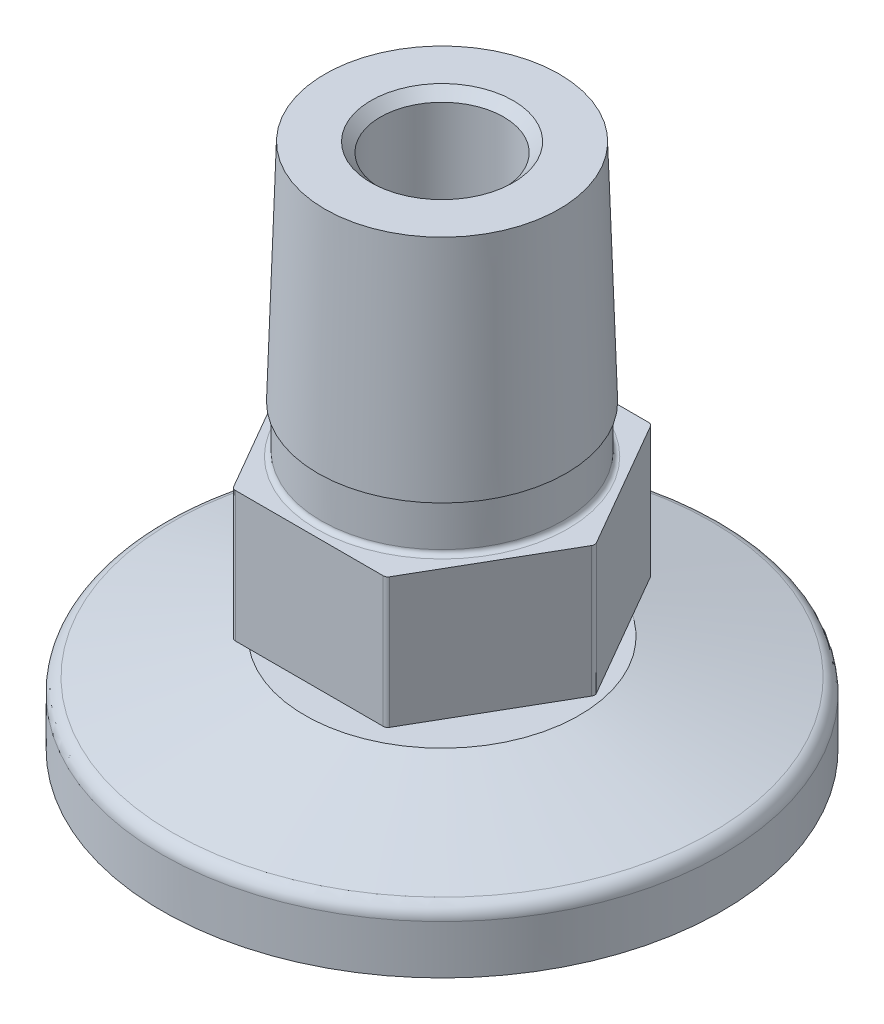
ISO-10303-21;
HEADER;
FILE_DESCRIPTION(('STEP AP214'),'2;1');
FILE_NAME('part.step','',(''),(''),'','','');
FILE_SCHEMA(('AUTOMOTIVE_DESIGN { 1 0 10303 214 1 1 1 1 }'));
ENDSEC;
DATA;
#1=APPLICATION_CONTEXT('core data for automotive mechanical design processes');
#2=APPLICATION_PROTOCOL_DEFINITION('international standard','automotive_design',2000,#1);
#3=PRODUCT_CONTEXT('',#1,'mechanical');
#4=PRODUCT('Part','Part','',(#3));
#5=PRODUCT_RELATED_PRODUCT_CATEGORY('part','',(#4));
#6=PRODUCT_DEFINITION_FORMATION('','',#4);
#7=PRODUCT_DEFINITION_CONTEXT('part definition',#1,'design');
#8=PRODUCT_DEFINITION('design','',#6,#7);
#9=PRODUCT_DEFINITION_SHAPE('','',#8);
#10=(LENGTH_UNIT() NAMED_UNIT(*) SI_UNIT(.MILLI.,.METRE.));
#11=(NAMED_UNIT(*) PLANE_ANGLE_UNIT() SI_UNIT($,.RADIAN.));
#12=(NAMED_UNIT(*) SI_UNIT($,.STERADIAN.) SOLID_ANGLE_UNIT());
#13=UNCERTAINTY_MEASURE_WITH_UNIT(LENGTH_MEASURE(1.E-05),#10,'distance_accuracy_value','');
#14=(GEOMETRIC_REPRESENTATION_CONTEXT(3) GLOBAL_UNCERTAINTY_ASSIGNED_CONTEXT((#13)) GLOBAL_UNIT_ASSIGNED_CONTEXT((#10,
#11,#12)) REPRESENTATION_CONTEXT('',''));
#15=CARTESIAN_POINT('',(0.,0.,0.));
#16=DIRECTION('',(0.,0.,1.));
#17=DIRECTION('',(1.,0.,0.));
#18=AXIS2_PLACEMENT_3D('',#15,#16,#17);
#19=CARTESIAN_POINT('',(0.,2.5,0.));
#20=DIRECTION('',(0.,1.,0.));
#21=DIRECTION('',(0.,0.,1.));
#22=AXIS2_PLACEMENT_3D('',#19,#20,#21);
#23=PLANE('',#22);
#24=CARTESIAN_POINT('',(0.,2.5,0.));
#25=DIRECTION('',(0.,-1.,0.));
#26=DIRECTION('',(0.,0.,-1.));
#27=AXIS2_PLACEMENT_3D('',#24,#25,#26);
#28=CIRCLE('',#27,8.1);
#29=CARTESIAN_POINT('',(0.,2.5,-8.1));
#30=VERTEX_POINT('',#29);
#31=EDGE_CURVE('E221',#30,#30,#28,.T.);
#32=ORIENTED_EDGE('',*,*,#31,.T.);
#33=EDGE_LOOP('',(#32));
#34=FACE_BOUND('',#33,.T.);
#35=CARTESIAN_POINT('',(0.,2.5,0.));
#36=DIRECTION('',(0.,1.,0.));
#37=DIRECTION('',(0.,0.,1.));
#38=AXIS2_PLACEMENT_3D('',#35,#36,#37);
#39=CIRCLE('',#38,3.302);
#40=CARTESIAN_POINT('',(0.,2.5,3.302));
#41=VERTEX_POINT('',#40);
#42=EDGE_CURVE('E572',#41,#41,#39,.F.);
#43=ORIENTED_EDGE('',*,*,#42,.F.);
#44=EDGE_LOOP('',(#43));
#45=FACE_BOUND('',#44,.T.);
#46=ADVANCED_FACE('F51',(#34,#45),#23,.F.);
#47=CARTESIAN_POINT('',(-6.27459645673935,28.194,0.));
#48=DIRECTION('',(0.,-1.,0.));
#49=DIRECTION('',(0.,0.,-1.));
#50=AXIS2_PLACEMENT_3D('',#47,#48,#49);
#51=PLANE('',#50);
#52=CARTESIAN_POINT('',(0.,28.194,0.));
#53=DIRECTION('',(0.,-1.,0.));
#54=DIRECTION('',(0.,0.,-1.));
#55=AXIS2_PLACEMENT_3D('',#52,#53,#54);
#56=CIRCLE('',#55,3.81000000000001);
#57=CARTESIAN_POINT('',(0.,28.194,-3.81000000000001));
#58=VERTEX_POINT('',#57);
#59=EDGE_CURVE('E311',#58,#58,#56,.T.);
#60=ORIENTED_EDGE('',*,*,#59,.T.);
#61=EDGE_LOOP('',(#60));
#62=FACE_BOUND('',#61,.T.);
#63=CARTESIAN_POINT('',(0.,28.194,0.));
#64=DIRECTION('',(0.,-1.,0.));
#65=DIRECTION('',(0.,0.,-1.));
#66=AXIS2_PLACEMENT_3D('',#63,#64,#65);
#67=CIRCLE('',#66,6.27459645673935);
#68=CARTESIAN_POINT('',(0.,28.194,-6.27459645673935));
#69=VERTEX_POINT('',#68);
#70=EDGE_CURVE('E180',#69,#69,#67,.T.);
#71=ORIENTED_EDGE('',*,*,#70,.F.);
#72=EDGE_LOOP('',(#71));
#73=FACE_BOUND('',#72,.T.);
#74=ADVANCED_FACE('F330',(#62,#73),#51,.F.);
#75=CARTESIAN_POINT('',(0.,13.589,0.));
#76=DIRECTION('',(0.,1.,0.));
#77=DIRECTION('',(0.,0.,1.));
#78=AXIS2_PLACEMENT_3D('',#75,#76,#77);
#79=PLANE('',#78);
#80=CARTESIAN_POINT('',(0.,13.589,0.));
#81=DIRECTION('',(0.,1.,0.));
#82=DIRECTION('',(0.,0.,1.));
#83=AXIS2_PLACEMENT_3D('',#80,#81,#82);
#84=CIRCLE('',#83,6.73099999999999);
#85=CARTESIAN_POINT('',(0.,13.589,6.73099999999999));
#86=VERTEX_POINT('',#85);
#87=EDGE_CURVE('E60',#86,#86,#84,.F.);
#88=ORIENTED_EDGE('',*,*,#87,.T.);
#89=EDGE_LOOP('',(#88));
#90=FACE_BOUND('',#89,.T.);
#91=DIRECTION('',(0.5,0.,-0.866025403784439));
#92=VECTOR('',#91,1.);
#93=CARTESIAN_POINT('',(4.10611511447662,13.589,7.112));
#94=LINE('',#93,#92);
#95=CARTESIAN_POINT('',(4.1794385986637,13.589,6.985));
#96=VERTEX_POINT('',#95);
#97=CARTESIAN_POINT('',(8.13890674476616,13.589,0.126999999999997));
#98=VERTEX_POINT('',#97);
#99=EDGE_CURVE('E193',#96,#98,#94,.T.);
#100=ORIENTED_EDGE('',*,*,#99,.T.);
#101=CARTESIAN_POINT('',(7.91893629220491,13.589,0.));
#102=DIRECTION('',(0.,1.,0.));
#103=DIRECTION('',(0.,0.,1.));
#104=AXIS2_PLACEMENT_3D('',#101,#102,#103);
#105=CIRCLE('',#104,0.254);
#106=CARTESIAN_POINT('',(8.13890674476616,13.589,-0.127000000000004));
#107=VERTEX_POINT('',#106);
#108=EDGE_CURVE('E270',#98,#107,#105,.T.);
#109=ORIENTED_EDGE('',*,*,#108,.T.);
#110=DIRECTION('',(-0.5,0.,-0.866025403784439));
#111=VECTOR('',#110,1.);
#112=CARTESIAN_POINT('',(8.21223022895324,13.589,0.));
#113=LINE('',#112,#111);
#114=CARTESIAN_POINT('',(4.1794385986637,13.589,-6.985));
#115=VERTEX_POINT('',#114);
#116=EDGE_CURVE('E170',#107,#115,#113,.T.);
#117=ORIENTED_EDGE('',*,*,#116,.T.);
#118=CARTESIAN_POINT('',(3.95946814610246,13.589,-6.858));
#119=DIRECTION('',(0.,1.,0.));
#120=DIRECTION('',(0.,0.,1.));
#121=AXIS2_PLACEMENT_3D('',#118,#119,#120);
#122=CIRCLE('',#121,0.254);
#123=CARTESIAN_POINT('',(3.95946814610246,13.589,-7.112));
#124=VERTEX_POINT('',#123);
#125=EDGE_CURVE('E261',#115,#124,#122,.T.);
#126=ORIENTED_EDGE('',*,*,#125,.T.);
#127=DIRECTION('',(-1.,0.,0.));
#128=VECTOR('',#127,1.);
#129=CARTESIAN_POINT('',(4.10611511447662,13.589,-7.112));
#130=LINE('',#129,#128);
#131=CARTESIAN_POINT('',(-3.95946814610245,13.589,-7.112));
#132=VERTEX_POINT('',#131);
#133=EDGE_CURVE('E581',#124,#132,#130,.T.);
#134=ORIENTED_EDGE('',*,*,#133,.T.);
#135=CARTESIAN_POINT('',(-3.95946814610245,13.589,-6.858));
#136=DIRECTION('',(0.,1.,0.));
#137=DIRECTION('',(0.,0.,1.));
#138=AXIS2_PLACEMENT_3D('',#135,#136,#137);
#139=CIRCLE('',#138,0.254);
#140=CARTESIAN_POINT('',(-4.1794385986637,13.589,-6.985));
#141=VERTEX_POINT('',#140);
#142=EDGE_CURVE('E264',#132,#141,#139,.T.);
#143=ORIENTED_EDGE('',*,*,#142,.T.);
#144=DIRECTION('',(-0.499999999999999,0.,0.866025403784439));
#145=VECTOR('',#144,1.);
#146=CARTESIAN_POINT('',(-4.10611511447662,13.589,-7.112));
#147=LINE('',#146,#145);
#148=CARTESIAN_POINT('',(-8.13890674476615,13.589,-0.126999999999994));
#149=VERTEX_POINT('',#148);
#150=EDGE_CURVE('E585',#141,#149,#147,.T.);
#151=ORIENTED_EDGE('',*,*,#150,.T.);
#152=CARTESIAN_POINT('',(-7.9189362922049,13.589,0.));
#153=DIRECTION('',(0.,1.,0.));
#154=DIRECTION('',(0.,0.,1.));
#155=AXIS2_PLACEMENT_3D('',#152,#153,#154);
#156=CIRCLE('',#155,0.254);
#157=CARTESIAN_POINT('',(-8.13890674476615,13.589,0.127000000000004));
#158=VERTEX_POINT('',#157);
#159=EDGE_CURVE('E267',#149,#158,#156,.T.);
#160=ORIENTED_EDGE('',*,*,#159,.T.);
#161=DIRECTION('',(0.5,0.,0.866025403784439));
#162=VECTOR('',#161,1.);
#163=CARTESIAN_POINT('',(-8.21223022895323,13.589,0.));
#164=LINE('',#163,#162);
#165=CARTESIAN_POINT('',(-4.17943859866369,13.589,6.985));
#166=VERTEX_POINT('',#165);
#167=EDGE_CURVE('E589',#158,#166,#164,.T.);
#168=ORIENTED_EDGE('',*,*,#167,.T.);
#169=CARTESIAN_POINT('',(-3.95946814610244,13.589,6.858));
#170=DIRECTION('',(0.,1.,0.));
#171=DIRECTION('',(0.,0.,1.));
#172=AXIS2_PLACEMENT_3D('',#169,#170,#171);
#173=CIRCLE('',#172,0.254);
#174=CARTESIAN_POINT('',(-3.95946814610244,13.589,7.112));
#175=VERTEX_POINT('',#174);
#176=EDGE_CURVE('E78',#166,#175,#173,.T.);
#177=ORIENTED_EDGE('',*,*,#176,.T.);
#178=DIRECTION('',(1.,0.,0.));
#179=VECTOR('',#178,1.);
#180=CARTESIAN_POINT('',(-4.10611511447661,13.589,7.112));
#181=LINE('',#180,#179);
#182=CARTESIAN_POINT('',(3.95946814610245,13.589,7.112));
#183=VERTEX_POINT('',#182);
#184=EDGE_CURVE('E591',#175,#183,#181,.T.);
#185=ORIENTED_EDGE('',*,*,#184,.T.);
#186=CARTESIAN_POINT('',(3.95946814610245,13.589,6.858));
#187=DIRECTION('',(0.,1.,0.));
#188=DIRECTION('',(0.,0.,1.));
#189=AXIS2_PLACEMENT_3D('',#186,#187,#188);
#190=CIRCLE('',#189,0.254);
#191=EDGE_CURVE('E258',#183,#96,#190,.T.);
#192=ORIENTED_EDGE('',*,*,#191,.T.);
#193=EDGE_LOOP('',(#100,#109,#117,#126,#134,#143,#151,#160,#168,#177,#185,#192));
#194=FACE_BOUND('',#193,.T.);
#195=ADVANCED_FACE('F319',(#90,#194),#79,.T.);
#196=CARTESIAN_POINT('',(0.,0.,8.1));
#197=DIRECTION('',(0.,1.,0.));
#198=DIRECTION('',(0.,0.,1.));
#199=AXIS2_PLACEMENT_3D('',#196,#197,#198);
#200=PLANE('',#199);
#201=CARTESIAN_POINT('',(0.,0.,0.));
#202=DIRECTION('',(0.,-1.,0.));
#203=DIRECTION('',(0.,0.,-1.));
#204=AXIS2_PLACEMENT_3D('',#201,#202,#203);
#205=CIRCLE('',#204,8.1);
#206=CARTESIAN_POINT('',(0.,0.,-8.1));
#207=VERTEX_POINT('',#206);
#208=EDGE_CURVE('E217',#207,#207,#205,.T.);
#209=ORIENTED_EDGE('',*,*,#208,.F.);
#210=EDGE_LOOP('',(#209));
#211=FACE_BOUND('',#210,.T.);
#212=CARTESIAN_POINT('',(0.,0.,0.));
#213=DIRECTION('',(0.,-1.,0.));
#214=DIRECTION('',(0.,0.,-1.));
#215=AXIS2_PLACEMENT_3D('',#212,#213,#214);
#216=CIRCLE('',#215,15.);
#217=CARTESIAN_POINT('',(0.,0.,-15.));
#218=VERTEX_POINT('',#217);
#219=EDGE_CURVE('E229',#218,#218,#216,.T.);
#220=ORIENTED_EDGE('',*,*,#219,.T.);
#221=EDGE_LOOP('',(#220));
#222=FACE_BOUND('',#221,.T.);
#223=ADVANCED_FACE('F353',(#211,#222),#200,.F.);
#224=CARTESIAN_POINT('',(0.,0.,0.));
#225=DIRECTION('',(0.,-1.,0.));
#226=DIRECTION('',(0.,0.,-1.));
#227=AXIS2_PLACEMENT_3D('',#224,#225,#226);
#228=CYLINDRICAL_SURFACE('',#227,15.);
#229=CARTESIAN_POINT('',(0.,2.61529683516003,0.));
#230=DIRECTION('',(0.,1.,0.));
#231=DIRECTION('',(0.,0.,1.));
#232=AXIS2_PLACEMENT_3D('',#229,#230,#231);
#233=CIRCLE('',#232,15.);
#234=CARTESIAN_POINT('',(0.,2.61529683516003,15.));
#235=VERTEX_POINT('',#234);
#236=EDGE_CURVE('E299',#235,#235,#233,.F.);
#237=ORIENTED_EDGE('',*,*,#236,.T.);
#238=EDGE_LOOP('',(#237));
#239=FACE_BOUND('',#238,.T.);
#240=ORIENTED_EDGE('',*,*,#219,.F.);
#241=EDGE_LOOP('',(#240));
#242=FACE_BOUND('',#241,.T.);
#243=ADVANCED_FACE('F349',(#239,#242),#228,.T.);
#244=CARTESIAN_POINT('',(0.,5.25,0.));
#245=DIRECTION('',(0.,-1.,0.));
#246=DIRECTION('',(0.,0.,-1.));
#247=AXIS2_PLACEMENT_3D('',#244,#245,#246);
#248=CONICAL_SURFACE('',#247,7.34929584448371,1.30899693899575);
#249=CARTESIAN_POINT('',(0.,3.3513323147923,0.));
#250=DIRECTION('',(0.,1.,0.));
#251=DIRECTION('',(0.,0.,1.));
#252=AXIS2_PLACEMENT_3D('',#249,#250,#251);
#253=CIRCLE('',#252,14.4352201123681);
#254=CARTESIAN_POINT('',(0.,3.3513323147923,14.4352201123681));
#255=VERTEX_POINT('',#254);
#256=EDGE_CURVE('E303',#255,#255,#253,.T.);
#257=ORIENTED_EDGE('',*,*,#256,.T.);
#258=EDGE_LOOP('',(#257));
#259=FACE_BOUND('',#258,.T.);
#260=CARTESIAN_POINT('',(0.,5.25,0.));
#261=DIRECTION('',(0.,-1.,0.));
#262=DIRECTION('',(0.,0.,-1.));
#263=AXIS2_PLACEMENT_3D('',#260,#261,#262);
#264=CIRCLE('',#263,7.34929584448371);
#265=CARTESIAN_POINT('',(0.,5.25,-7.34929584448371));
#266=VERTEX_POINT('',#265);
#267=EDGE_CURVE('E225',#266,#266,#264,.T.);
#268=ORIENTED_EDGE('',*,*,#267,.T.);
#269=EDGE_LOOP('',(#268));
#270=FACE_BOUND('',#269,.T.);
#271=ADVANCED_FACE('F345',(#259,#270),#248,.T.);
#272=CARTESIAN_POINT('',(0.,5.25,7.34929584448371));
#273=DIRECTION('',(0.,-1.,0.));
#274=DIRECTION('',(0.,0.,-1.));
#275=AXIS2_PLACEMENT_3D('',#272,#273,#274);
#276=PLANE('',#275);
#277=CARTESIAN_POINT('',(0.,5.25,0.));
#278=DIRECTION('',(0.,-1.,0.));
#279=DIRECTION('',(0.,0.,-1.));
#280=AXIS2_PLACEMENT_3D('',#277,#278,#279);
#281=CIRCLE('',#280,4.445);
#282=CARTESIAN_POINT('',(0.,5.25,-4.445));
#283=VERTEX_POINT('',#282);
#284=EDGE_CURVE('E213',#283,#283,#281,.T.);
#285=ORIENTED_EDGE('',*,*,#284,.T.);
#286=EDGE_LOOP('',(#285));
#287=FACE_BOUND('',#286,.T.);
#288=ORIENTED_EDGE('',*,*,#267,.F.);
#289=EDGE_LOOP('',(#288));
#290=FACE_BOUND('',#289,.T.);
#291=ADVANCED_FACE('F342',(#287,#290),#276,.F.);
#292=CARTESIAN_POINT('',(0.,0.,0.));
#293=DIRECTION('',(0.,-1.,0.));
#294=DIRECTION('',(0.,0.,-1.));
#295=AXIS2_PLACEMENT_3D('',#292,#293,#294);
#296=CYLINDRICAL_SURFACE('',#295,8.1);
#297=ORIENTED_EDGE('',*,*,#31,.F.);
#298=EDGE_LOOP('',(#297));
#299=FACE_BOUND('',#298,.T.);
#300=ORIENTED_EDGE('',*,*,#208,.T.);
#301=EDGE_LOOP('',(#300));
#302=FACE_BOUND('',#301,.T.);
#303=ADVANCED_FACE('F340',(#299,#302),#296,.F.);
#304=CARTESIAN_POINT('',(0.,25.7803585694968,0.));
#305=DIRECTION('',(0.,-1.,0.));
#306=DIRECTION('',(0.,0.,-1.));
#307=AXIS2_PLACEMENT_3D('',#304,#305,#306);
#308=CYLINDRICAL_SURFACE('',#307,4.445);
#309=CARTESIAN_POINT('',(0.,6.604,0.));
#310=DIRECTION('',(0.,1.,0.));
#311=DIRECTION('',(0.,0.,1.));
#312=AXIS2_PLACEMENT_3D('',#309,#310,#311);
#313=CIRCLE('',#312,4.445);
#314=CARTESIAN_POINT('',(0.,6.604,4.445));
#315=VERTEX_POINT('',#314);
#316=EDGE_CURVE('E209',#315,#315,#313,.F.);
#317=ORIENTED_EDGE('',*,*,#316,.T.);
#318=EDGE_LOOP('',(#317));
#319=FACE_BOUND('',#318,.T.);
#320=ORIENTED_EDGE('',*,*,#284,.F.);
#321=EDGE_LOOP('',(#320));
#322=FACE_BOUND('',#321,.T.);
#323=ADVANCED_FACE('F483',(#319,#322),#308,.T.);
#324=CARTESIAN_POINT('',(8.21223022895324,13.589,0.));
#325=DIRECTION('',(-0.866025403784438,0.,0.5));
#326=DIRECTION('',(0.5,0.,0.866025403784439));
#327=AXIS2_PLACEMENT_3D('',#324,#325,#326);
#328=PLANE('',#327);
#329=ORIENTED_EDGE('',*,*,#116,.F.);
#330=DIRECTION('',(0.,-1.,0.));
#331=VECTOR('',#330,1.);
#332=CARTESIAN_POINT('',(8.13890674476616,13.589,-0.127000000000003));
#333=LINE('',#332,#331);
#334=CARTESIAN_POINT('',(8.13890674476616,6.604,-0.127000000000004));
#335=VERTEX_POINT('',#334);
#336=EDGE_CURVE('E153',#107,#335,#333,.T.);
#337=ORIENTED_EDGE('',*,*,#336,.T.);
#338=DIRECTION('',(-0.5,0.,-0.866025403784439));
#339=VECTOR('',#338,1.);
#340=CARTESIAN_POINT('',(8.21223022895324,6.604,0.));
#341=LINE('',#340,#339);
#342=CARTESIAN_POINT('',(4.1794385986637,6.604,-6.985));
#343=VERTEX_POINT('',#342);
#344=EDGE_CURVE('E167',#335,#343,#341,.T.);
#345=ORIENTED_EDGE('',*,*,#344,.T.);
#346=DIRECTION('',(0.,-1.,0.));
#347=VECTOR('',#346,1.);
#348=CARTESIAN_POINT('',(4.1794385986637,13.589,-6.985));
#349=LINE('',#348,#347);
#350=EDGE_CURVE('E173',#343,#115,#349,.F.);
#351=ORIENTED_EDGE('',*,*,#350,.T.);
#352=EDGE_LOOP('',(#329,#337,#345,#351));
#353=FACE_BOUND('',#352,.T.);
#354=ADVANCED_FACE('F166',(#353),#328,.F.);
#355=CARTESIAN_POINT('',(4.10611511447662,13.589,-7.112));
#356=DIRECTION('',(0.,0.,1.));
#357=DIRECTION('',(1.,0.,0.));
#358=AXIS2_PLACEMENT_3D('',#355,#356,#357);
#359=PLANE('',#358);
#360=DIRECTION('',(-1.,0.,0.));
#361=VECTOR('',#360,1.);
#362=CARTESIAN_POINT('',(4.10611511447662,6.604,-7.112));
#363=LINE('',#362,#361);
#364=CARTESIAN_POINT('',(3.95946814610246,6.604,-7.112));
#365=VERTEX_POINT('',#364);
#366=CARTESIAN_POINT('',(-3.95946814610245,6.604,-7.112));
#367=VERTEX_POINT('',#366);
#368=EDGE_CURVE('E179',#365,#367,#363,.T.);
#369=ORIENTED_EDGE('',*,*,#368,.T.);
#370=DIRECTION('',(0.,-1.,0.));
#371=VECTOR('',#370,1.);
#372=CARTESIAN_POINT('',(-3.95946814610245,13.589,-7.112));
#373=LINE('',#372,#371);
#374=EDGE_CURVE('E290',#367,#132,#373,.F.);
#375=ORIENTED_EDGE('',*,*,#374,.T.);
#376=ORIENTED_EDGE('',*,*,#133,.F.);
#377=DIRECTION('',(0.,-1.,0.));
#378=VECTOR('',#377,1.);
#379=CARTESIAN_POINT('',(3.95946814610246,13.589,-7.112));
#380=LINE('',#379,#378);
#381=EDGE_CURVE('E286',#124,#365,#380,.T.);
#382=ORIENTED_EDGE('',*,*,#381,.T.);
#383=EDGE_LOOP('',(#369,#375,#376,#382));
#384=FACE_BOUND('',#383,.T.);
#385=ADVANCED_FACE('F494',(#384),#359,.F.);
#386=CARTESIAN_POINT('',(-4.10611511447662,13.589,-7.112));
#387=DIRECTION('',(0.866025403784439,0.,0.499999999999999));
#388=DIRECTION('',(0.499999999999999,0.,-0.866025403784439));
#389=AXIS2_PLACEMENT_3D('',#386,#387,#388);
#390=PLANE('',#389);
#391=DIRECTION('',(-0.499999999999999,0.,0.866025403784439));
#392=VECTOR('',#391,1.);
#393=CARTESIAN_POINT('',(-4.10611511447662,6.604,-7.112));
#394=LINE('',#393,#392);
#395=CARTESIAN_POINT('',(-4.1794385986637,6.604,-6.985));
#396=VERTEX_POINT('',#395);
#397=CARTESIAN_POINT('',(-8.13890674476615,6.604,-0.126999999999994));
#398=VERTEX_POINT('',#397);
#399=EDGE_CURVE('E186',#396,#398,#394,.T.);
#400=ORIENTED_EDGE('',*,*,#399,.T.);
#401=DIRECTION('',(0.,-1.,0.));
#402=VECTOR('',#401,1.);
#403=CARTESIAN_POINT('',(-8.13890674476615,13.589,-0.126999999999995));
#404=LINE('',#403,#402);
#405=EDGE_CURVE('E284',#398,#149,#404,.F.);
#406=ORIENTED_EDGE('',*,*,#405,.T.);
#407=ORIENTED_EDGE('',*,*,#150,.F.);
#408=DIRECTION('',(0.,-1.,0.));
#409=VECTOR('',#408,1.);
#410=CARTESIAN_POINT('',(-4.1794385986637,13.589,-6.985));
#411=LINE('',#410,#409);
#412=EDGE_CURVE('E280',#141,#396,#411,.T.);
#413=ORIENTED_EDGE('',*,*,#412,.T.);
#414=EDGE_LOOP('',(#400,#406,#407,#413));
#415=FACE_BOUND('',#414,.T.);
#416=ADVANCED_FACE('F500',(#415),#390,.F.);
#417=CARTESIAN_POINT('',(-8.21223022895323,13.589,0.));
#418=DIRECTION('',(0.866025403784439,0.,-0.5));
#419=DIRECTION('',(-0.5,0.,-0.866025403784439));
#420=AXIS2_PLACEMENT_3D('',#417,#418,#419);
#421=PLANE('',#420);
#422=ORIENTED_EDGE('',*,*,#167,.F.);
#423=DIRECTION('',(0.,-1.,0.));
#424=VECTOR('',#423,1.);
#425=CARTESIAN_POINT('',(-8.13890674476615,13.589,0.127000000000004));
#426=LINE('',#425,#424);
#427=CARTESIAN_POINT('',(-8.13890674476615,6.604,0.127000000000004));
#428=VERTEX_POINT('',#427);
#429=EDGE_CURVE('E276',#158,#428,#426,.T.);
#430=ORIENTED_EDGE('',*,*,#429,.T.);
#431=DIRECTION('',(0.5,0.,0.866025403784439));
#432=VECTOR('',#431,1.);
#433=CARTESIAN_POINT('',(-8.21223022895323,6.604,0.));
#434=LINE('',#433,#432);
#435=CARTESIAN_POINT('',(-4.17943859866369,6.604,6.985));
#436=VERTEX_POINT('',#435);
#437=EDGE_CURVE('E199',#428,#436,#434,.T.);
#438=ORIENTED_EDGE('',*,*,#437,.T.);
#439=DIRECTION('',(0.,-1.,0.));
#440=VECTOR('',#439,1.);
#441=CARTESIAN_POINT('',(-4.17943859866369,13.589,6.985));
#442=LINE('',#441,#440);
#443=EDGE_CURVE('E273',#436,#166,#442,.F.);
#444=ORIENTED_EDGE('',*,*,#443,.T.);
#445=EDGE_LOOP('',(#422,#430,#438,#444));
#446=FACE_BOUND('',#445,.T.);
#447=ADVANCED_FACE('F507',(#446),#421,.F.);
#448=CARTESIAN_POINT('',(-4.10611511447661,13.589,7.112));
#449=DIRECTION('',(0.,0.,-1.));
#450=DIRECTION('',(-1.,0.,0.));
#451=AXIS2_PLACEMENT_3D('',#448,#449,#450);
#452=PLANE('',#451);
#453=DIRECTION('',(1.,0.,0.));
#454=VECTOR('',#453,1.);
#455=CARTESIAN_POINT('',(-4.10611511447661,6.604,7.112));
#456=LINE('',#455,#454);
#457=CARTESIAN_POINT('',(-3.95946814610244,6.604,7.112));
#458=VERTEX_POINT('',#457);
#459=CARTESIAN_POINT('',(3.95946814610245,6.604,7.112));
#460=VERTEX_POINT('',#459);
#461=EDGE_CURVE('E203',#458,#460,#456,.T.);
#462=ORIENTED_EDGE('',*,*,#461,.T.);
#463=DIRECTION('',(0.,-1.,0.));
#464=VECTOR('',#463,1.);
#465=CARTESIAN_POINT('',(3.95946814610245,13.589,7.112));
#466=LINE('',#465,#464);
#467=EDGE_CURVE('E70',#460,#183,#466,.F.);
#468=ORIENTED_EDGE('',*,*,#467,.T.);
#469=ORIENTED_EDGE('',*,*,#184,.F.);
#470=DIRECTION('',(0.,-1.,0.));
#471=VECTOR('',#470,1.);
#472=CARTESIAN_POINT('',(-3.95946814610244,13.589,7.112));
#473=LINE('',#472,#471);
#474=EDGE_CURVE('E293',#175,#458,#473,.T.);
#475=ORIENTED_EDGE('',*,*,#474,.T.);
#476=EDGE_LOOP('',(#462,#468,#469,#475));
#477=FACE_BOUND('',#476,.T.);
#478=ADVANCED_FACE('F514',(#477),#452,.F.);
#479=CARTESIAN_POINT('',(4.10611511447662,13.589,7.112));
#480=DIRECTION('',(-0.866025403784439,0.,-0.5));
#481=DIRECTION('',(-0.5,0.,0.866025403784439));
#482=AXIS2_PLACEMENT_3D('',#479,#480,#481);
#483=PLANE('',#482);
#484=DIRECTION('',(0.5,0.,-0.866025403784439));
#485=VECTOR('',#484,1.);
#486=CARTESIAN_POINT('',(4.10611511447662,6.604,7.112));
#487=LINE('',#486,#485);
#488=CARTESIAN_POINT('',(4.1794385986637,6.604,6.985));
#489=VERTEX_POINT('',#488);
#490=CARTESIAN_POINT('',(8.13890674476616,6.604,0.126999999999997));
#491=VERTEX_POINT('',#490);
#492=EDGE_CURVE('E206',#489,#491,#487,.T.);
#493=ORIENTED_EDGE('',*,*,#492,.T.);
#494=DIRECTION('',(0.,-1.,0.));
#495=VECTOR('',#494,1.);
#496=CARTESIAN_POINT('',(8.13890674476616,13.589,0.126999999999996));
#497=LINE('',#496,#495);
#498=EDGE_CURVE('E154',#491,#98,#497,.F.);
#499=ORIENTED_EDGE('',*,*,#498,.T.);
#500=ORIENTED_EDGE('',*,*,#99,.F.);
#501=DIRECTION('',(0.,-1.,0.));
#502=VECTOR('',#501,1.);
#503=CARTESIAN_POINT('',(4.1794385986637,13.589,6.985));
#504=LINE('',#503,#502);
#505=EDGE_CURVE('E160',#96,#489,#504,.T.);
#506=ORIENTED_EDGE('',*,*,#505,.T.);
#507=EDGE_LOOP('',(#493,#499,#500,#506));
#508=FACE_BOUND('',#507,.T.);
#509=ADVANCED_FACE('F521',(#508),#483,.F.);
#510=CARTESIAN_POINT('',(0.,6.604,0.));
#511=DIRECTION('',(0.,1.,0.));
#512=DIRECTION('',(0.,0.,1.));
#513=AXIS2_PLACEMENT_3D('',#510,#511,#512);
#514=PLANE('',#513);
#515=ORIENTED_EDGE('',*,*,#316,.F.);
#516=EDGE_LOOP('',(#515));
#517=FACE_BOUND('',#516,.T.);
#518=ORIENTED_EDGE('',*,*,#344,.F.);
#519=CARTESIAN_POINT('',(7.91893629220491,6.604,0.));
#520=DIRECTION('',(0.,1.,0.));
#521=DIRECTION('',(0.,0.,1.));
#522=AXIS2_PLACEMENT_3D('',#519,#520,#521);
#523=CIRCLE('',#522,0.254);
#524=EDGE_CURVE('E149',#335,#491,#523,.F.);
#525=ORIENTED_EDGE('',*,*,#524,.T.);
#526=ORIENTED_EDGE('',*,*,#492,.F.);
#527=CARTESIAN_POINT('',(3.95946814610245,6.604,6.858));
#528=DIRECTION('',(0.,1.,0.));
#529=DIRECTION('',(0.,0.,1.));
#530=AXIS2_PLACEMENT_3D('',#527,#528,#529);
#531=CIRCLE('',#530,0.254);
#532=EDGE_CURVE('E241',#489,#460,#531,.F.);
#533=ORIENTED_EDGE('',*,*,#532,.T.);
#534=ORIENTED_EDGE('',*,*,#461,.F.);
#535=CARTESIAN_POINT('',(-3.95946814610244,6.604,6.858));
#536=DIRECTION('',(0.,1.,0.));
#537=DIRECTION('',(0.,0.,1.));
#538=AXIS2_PLACEMENT_3D('',#535,#536,#537);
#539=CIRCLE('',#538,0.254);
#540=EDGE_CURVE('E172',#458,#436,#539,.F.);
#541=ORIENTED_EDGE('',*,*,#540,.T.);
#542=ORIENTED_EDGE('',*,*,#437,.F.);
#543=CARTESIAN_POINT('',(-7.9189362922049,6.604,0.));
#544=DIRECTION('',(0.,1.,0.));
#545=DIRECTION('',(0.,0.,1.));
#546=AXIS2_PLACEMENT_3D('',#543,#544,#545);
#547=CIRCLE('',#546,0.254);
#548=EDGE_CURVE('E161',#428,#398,#547,.F.);
#549=ORIENTED_EDGE('',*,*,#548,.T.);
#550=ORIENTED_EDGE('',*,*,#399,.F.);
#551=CARTESIAN_POINT('',(-3.95946814610245,6.604,-6.858));
#552=DIRECTION('',(0.,1.,0.));
#553=DIRECTION('',(0.,0.,1.));
#554=AXIS2_PLACEMENT_3D('',#551,#552,#553);
#555=CIRCLE('',#554,0.254);
#556=EDGE_CURVE('E246',#396,#367,#555,.F.);
#557=ORIENTED_EDGE('',*,*,#556,.T.);
#558=ORIENTED_EDGE('',*,*,#368,.F.);
#559=CARTESIAN_POINT('',(3.95946814610246,6.604,-6.858));
#560=DIRECTION('',(0.,1.,0.));
#561=DIRECTION('',(0.,0.,1.));
#562=AXIS2_PLACEMENT_3D('',#559,#560,#561);
#563=CIRCLE('',#562,0.254);
#564=EDGE_CURVE('E177',#365,#343,#563,.F.);
#565=ORIENTED_EDGE('',*,*,#564,.T.);
#566=EDGE_LOOP('',(#518,#525,#526,#533,#534,#541,#542,#549,#550,#557,#558,#565));
#567=FACE_BOUND('',#566,.T.);
#568=ADVANCED_FACE('F175',(#517,#567),#514,.F.);
#569=CARTESIAN_POINT('',(-21.717,16.129,0.));
#570=DIRECTION('',(0.,-1.,0.));
#571=DIRECTION('',(0.,0.,-1.));
#572=AXIS2_PLACEMENT_3D('',#569,#570,#571);
#573=PLANE('',#572);
#574=CARTESIAN_POINT('',(0.,16.129,0.));
#575=DIRECTION('',(0.,-1.,0.));
#576=DIRECTION('',(0.,0.,-1.));
#577=AXIS2_PLACEMENT_3D('',#574,#575,#576);
#578=CIRCLE('',#577,6.47699999999999);
#579=CARTESIAN_POINT('',(0.,16.129,-6.47699999999999));
#580=VERTEX_POINT('',#579);
#581=EDGE_CURVE('E236',#580,#580,#578,.T.);
#582=ORIENTED_EDGE('',*,*,#581,.F.);
#583=EDGE_LOOP('',(#582));
#584=FACE_BOUND('',#583,.T.);
#585=CARTESIAN_POINT('',(0.,16.129,0.));
#586=DIRECTION('',(0.,-1.,0.));
#587=DIRECTION('',(0.,0.,-1.));
#588=AXIS2_PLACEMENT_3D('',#585,#586,#587);
#589=CIRCLE('',#588,6.65162547073728);
#590=CARTESIAN_POINT('',(0.,16.129,-6.65162547073728));
#591=VERTEX_POINT('',#590);
#592=EDGE_CURVE('E190',#591,#591,#589,.T.);
#593=ORIENTED_EDGE('',*,*,#592,.T.);
#594=EDGE_LOOP('',(#593));
#595=FACE_BOUND('',#594,.T.);
#596=ADVANCED_FACE('F424',(#584,#595),#573,.T.);
#597=CARTESIAN_POINT('',(0.,0.,0.));
#598=DIRECTION('',(0.,-1.,0.));
#599=DIRECTION('',(0.,0.,-1.));
#600=AXIS2_PLACEMENT_3D('',#597,#598,#599);
#601=CYLINDRICAL_SURFACE('',#600,6.47699999999999);
#602=CARTESIAN_POINT('',(0.,13.843,0.));
#603=DIRECTION('',(0.,1.,0.));
#604=DIRECTION('',(0.,0.,1.));
#605=AXIS2_PLACEMENT_3D('',#602,#603,#604);
#606=CIRCLE('',#605,6.47699999999999);
#607=CARTESIAN_POINT('',(0.,13.843,6.47699999999999));
#608=VERTEX_POINT('',#607);
#609=EDGE_CURVE('E12',#608,#608,#606,.T.);
#610=ORIENTED_EDGE('',*,*,#609,.T.);
#611=EDGE_LOOP('',(#610));
#612=FACE_BOUND('',#611,.T.);
#613=ORIENTED_EDGE('',*,*,#581,.T.);
#614=EDGE_LOOP('',(#613));
#615=FACE_BOUND('',#614,.T.);
#616=ADVANCED_FACE('F419',(#612,#615),#601,.T.);
#617=CARTESIAN_POINT('',(0.,28.194,0.));
#618=DIRECTION('',(0.,-1.,0.));
#619=DIRECTION('',(0.,0.,-1.));
#620=AXIS2_PLACEMENT_3D('',#617,#618,#619);
#621=CONICAL_SURFACE('',#620,6.27459645673935,0.0312396482814392);
#622=ORIENTED_EDGE('',*,*,#70,.T.);
#623=EDGE_LOOP('',(#622));
#624=FACE_BOUND('',#623,.T.);
#625=ORIENTED_EDGE('',*,*,#592,.F.);
#626=EDGE_LOOP('',(#625));
#627=FACE_BOUND('',#626,.T.);
#628=ADVANCED_FACE('F423',(#624,#627),#621,.T.);
#629=CARTESIAN_POINT('',(0.,28.194,0.));
#630=DIRECTION('',(0.,-1.,0.));
#631=DIRECTION('',(0.,0.,-1.));
#632=AXIS2_PLACEMENT_3D('',#629,#630,#631);
#633=CYLINDRICAL_SURFACE('',#632,3.302);
#634=CARTESIAN_POINT('',(0.,27.686,0.));
#635=DIRECTION('',(0.,-1.,0.));
#636=DIRECTION('',(0.,0.,-1.));
#637=AXIS2_PLACEMENT_3D('',#634,#635,#636);
#638=CIRCLE('',#637,3.302);
#639=CARTESIAN_POINT('',(0.,27.686,-3.302));
#640=VERTEX_POINT('',#639);
#641=EDGE_CURVE('E307',#640,#640,#638,.F.);
#642=ORIENTED_EDGE('',*,*,#641,.T.);
#643=EDGE_LOOP('',(#642));
#644=FACE_BOUND('',#643,.T.);
#645=ORIENTED_EDGE('',*,*,#42,.T.);
#646=EDGE_LOOP('',(#645));
#647=FACE_BOUND('',#646,.T.);
#648=ADVANCED_FACE('F361',(#644,#647),#633,.F.);
#649=CARTESIAN_POINT('',(7.91893629220491,13.589,0.));
#650=DIRECTION('',(0.,-1.,0.));
#651=DIRECTION('',(0.,0.,-1.));
#652=AXIS2_PLACEMENT_3D('',#649,#650,#651);
#653=CYLINDRICAL_SURFACE('',#652,0.254);
#654=ORIENTED_EDGE('',*,*,#108,.F.);
#655=ORIENTED_EDGE('',*,*,#498,.F.);
#656=ORIENTED_EDGE('',*,*,#524,.F.);
#657=ORIENTED_EDGE('',*,*,#336,.F.);
#658=EDGE_LOOP('',(#654,#655,#656,#657));
#659=FACE_BOUND('',#658,.T.);
#660=ADVANCED_FACE('F152',(#659),#653,.T.);
#661=CARTESIAN_POINT('',(-7.9189362922049,13.589,0.));
#662=DIRECTION('',(0.,-1.,0.));
#663=DIRECTION('',(0.,0.,-1.));
#664=AXIS2_PLACEMENT_3D('',#661,#662,#663);
#665=CYLINDRICAL_SURFACE('',#664,0.254);
#666=ORIENTED_EDGE('',*,*,#159,.F.);
#667=ORIENTED_EDGE('',*,*,#405,.F.);
#668=ORIENTED_EDGE('',*,*,#548,.F.);
#669=ORIENTED_EDGE('',*,*,#429,.F.);
#670=EDGE_LOOP('',(#666,#667,#668,#669));
#671=FACE_BOUND('',#670,.T.);
#672=ADVANCED_FACE('F360',(#671),#665,.T.);
#673=CARTESIAN_POINT('',(-3.95946814610245,13.589,-6.858));
#674=DIRECTION('',(0.,-1.,0.));
#675=DIRECTION('',(0.,0.,-1.));
#676=AXIS2_PLACEMENT_3D('',#673,#674,#675);
#677=CYLINDRICAL_SURFACE('',#676,0.254);
#678=ORIENTED_EDGE('',*,*,#142,.F.);
#679=ORIENTED_EDGE('',*,*,#374,.F.);
#680=ORIENTED_EDGE('',*,*,#556,.F.);
#681=ORIENTED_EDGE('',*,*,#412,.F.);
#682=EDGE_LOOP('',(#678,#679,#680,#681));
#683=FACE_BOUND('',#682,.T.);
#684=ADVANCED_FACE('F364',(#683),#677,.T.);
#685=CARTESIAN_POINT('',(3.95946814610246,13.589,-6.858));
#686=DIRECTION('',(0.,-1.,0.));
#687=DIRECTION('',(0.,0.,-1.));
#688=AXIS2_PLACEMENT_3D('',#685,#686,#687);
#689=CYLINDRICAL_SURFACE('',#688,0.254);
#690=ORIENTED_EDGE('',*,*,#125,.F.);
#691=ORIENTED_EDGE('',*,*,#350,.F.);
#692=ORIENTED_EDGE('',*,*,#564,.F.);
#693=ORIENTED_EDGE('',*,*,#381,.F.);
#694=EDGE_LOOP('',(#690,#691,#692,#693));
#695=FACE_BOUND('',#694,.T.);
#696=ADVANCED_FACE('F368',(#695),#689,.T.);
#697=CARTESIAN_POINT('',(3.95946814610245,13.589,6.858));
#698=DIRECTION('',(0.,-1.,0.));
#699=DIRECTION('',(0.,0.,-1.));
#700=AXIS2_PLACEMENT_3D('',#697,#698,#699);
#701=CYLINDRICAL_SURFACE('',#700,0.254);
#702=ORIENTED_EDGE('',*,*,#191,.F.);
#703=ORIENTED_EDGE('',*,*,#467,.F.);
#704=ORIENTED_EDGE('',*,*,#532,.F.);
#705=ORIENTED_EDGE('',*,*,#505,.F.);
#706=EDGE_LOOP('',(#702,#703,#704,#705));
#707=FACE_BOUND('',#706,.T.);
#708=ADVANCED_FACE('F372',(#707),#701,.T.);
#709=CARTESIAN_POINT('',(-3.95946814610244,13.589,6.858));
#710=DIRECTION('',(0.,-1.,0.));
#711=DIRECTION('',(0.,0.,-1.));
#712=AXIS2_PLACEMENT_3D('',#709,#710,#711);
#713=CYLINDRICAL_SURFACE('',#712,0.254);
#714=ORIENTED_EDGE('',*,*,#176,.F.);
#715=ORIENTED_EDGE('',*,*,#443,.F.);
#716=ORIENTED_EDGE('',*,*,#540,.F.);
#717=ORIENTED_EDGE('',*,*,#474,.F.);
#718=EDGE_LOOP('',(#714,#715,#716,#717));
#719=FACE_BOUND('',#718,.T.);
#720=ADVANCED_FACE('F376',(#719),#713,.T.);
#721=CARTESIAN_POINT('',(0.,2.61529683516003,0.));
#722=DIRECTION('',(0.,1.,0.));
#723=DIRECTION('',(0.,0.,1.));
#724=AXIS2_PLACEMENT_3D('',#721,#722,#723);
#725=TOROIDAL_SURFACE('',#724,14.238,0.762);
#726=ORIENTED_EDGE('',*,*,#256,.F.);
#727=EDGE_LOOP('',(#726));
#728=FACE_BOUND('',#727,.T.);
#729=ORIENTED_EDGE('',*,*,#236,.F.);
#730=EDGE_LOOP('',(#729));
#731=FACE_BOUND('',#730,.T.);
#732=ADVANCED_FACE('F326',(#728,#731),#725,.T.);
#733=CARTESIAN_POINT('',(0.,27.686,0.));
#734=DIRECTION('',(0.,1.,0.));
#735=DIRECTION('',(0.,0.,1.));
#736=AXIS2_PLACEMENT_3D('',#733,#734,#735);
#737=CONICAL_SURFACE('',#736,3.302,0.785398163397455);
#738=ORIENTED_EDGE('',*,*,#59,.F.);
#739=EDGE_LOOP('',(#738));
#740=FACE_BOUND('',#739,.T.);
#741=ORIENTED_EDGE('',*,*,#641,.F.);
#742=EDGE_LOOP('',(#741));
#743=FACE_BOUND('',#742,.T.);
#744=ADVANCED_FACE('F322',(#740,#743),#737,.F.);
#745=CARTESIAN_POINT('',(0.,13.843,0.));
#746=DIRECTION('',(0.,1.,0.));
#747=DIRECTION('',(0.,0.,1.));
#748=AXIS2_PLACEMENT_3D('',#745,#746,#747);
#749=TOROIDAL_SURFACE('',#748,6.73099999999999,0.254);
#750=ORIENTED_EDGE('',*,*,#609,.F.);
#751=EDGE_LOOP('',(#750));
#752=FACE_BOUND('',#751,.T.);
#753=ORIENTED_EDGE('',*,*,#87,.F.);
#754=EDGE_LOOP('',(#753));
#755=FACE_BOUND('',#754,.T.);
#756=ADVANCED_FACE('F53',(#752,#755),#749,.F.);
#757=CLOSED_SHELL('',(#46,#74,#195,#223,#243,#271,#291,#303,#323,#354,#385,#416,#447,#478,#509,
#568,#596,#616,#628,#648,#660,#672,#684,#696,#708,#720,#732,#744,#756));
#758=MANIFOLD_SOLID_BREP('B2',#757);
#759=ADVANCED_BREP_SHAPE_REPRESENTATION('',(#18,#758),#14);
#760=SHAPE_DEFINITION_REPRESENTATION(#9,#759);
ENDSEC;
END-ISO-10303-21;
